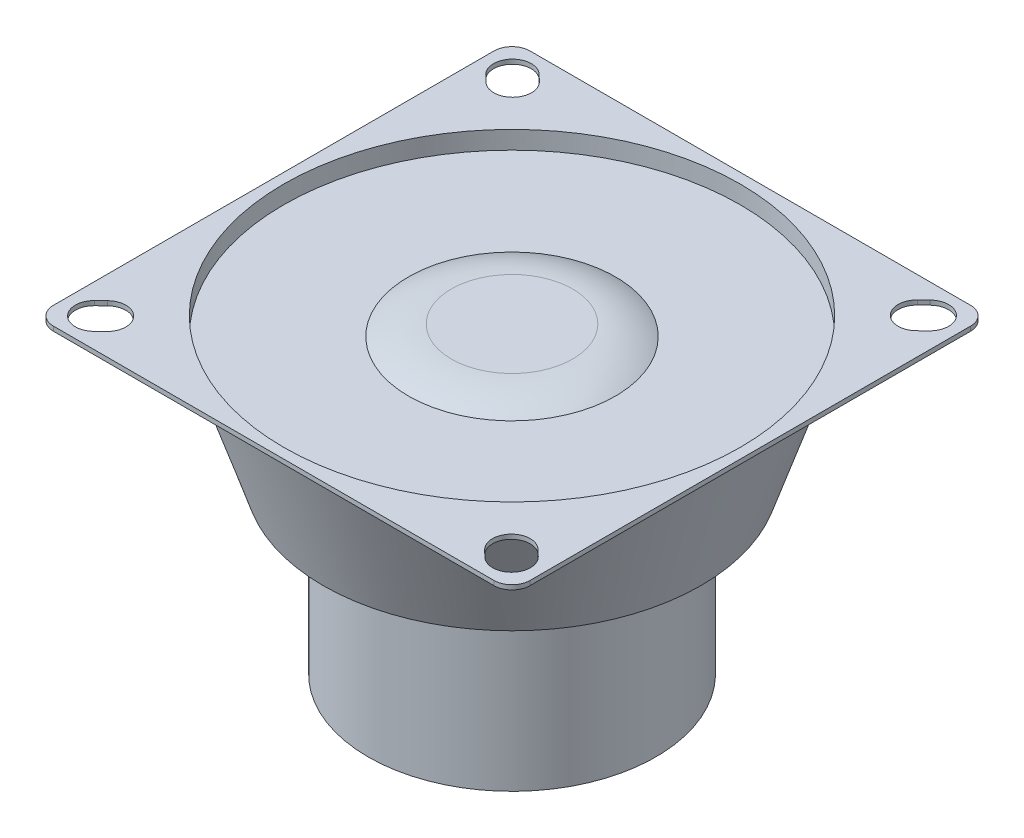
ISO-10303-21;
HEADER;
FILE_DESCRIPTION(('STEP AP214'),'2;1');
FILE_NAME('part.step','',(''),(''),'','','');
FILE_SCHEMA(('AUTOMOTIVE_DESIGN { 1 0 10303 214 1 1 1 1 }'));
ENDSEC;
DATA;
#1=APPLICATION_CONTEXT('core data for automotive mechanical design processes');
#2=APPLICATION_PROTOCOL_DEFINITION('international standard','automotive_design',2000,#1);
#3=PRODUCT_CONTEXT('',#1,'mechanical');
#4=PRODUCT('Part','Part','',(#3));
#5=PRODUCT_RELATED_PRODUCT_CATEGORY('part','',(#4));
#6=PRODUCT_DEFINITION_FORMATION('','',#4);
#7=PRODUCT_DEFINITION_CONTEXT('part definition',#1,'design');
#8=PRODUCT_DEFINITION('design','',#6,#7);
#9=PRODUCT_DEFINITION_SHAPE('','',#8);
#10=(LENGTH_UNIT() NAMED_UNIT(*) SI_UNIT(.MILLI.,.METRE.));
#11=(NAMED_UNIT(*) PLANE_ANGLE_UNIT() SI_UNIT($,.RADIAN.));
#12=(NAMED_UNIT(*) SI_UNIT($,.STERADIAN.) SOLID_ANGLE_UNIT());
#13=UNCERTAINTY_MEASURE_WITH_UNIT(LENGTH_MEASURE(1.E-05),#10,'distance_accuracy_value','');
#14=(GEOMETRIC_REPRESENTATION_CONTEXT(3) GLOBAL_UNCERTAINTY_ASSIGNED_CONTEXT((#13)) GLOBAL_UNIT_ASSIGNED_CONTEXT((#10,
#11,#12)) REPRESENTATION_CONTEXT('',''));
#15=CARTESIAN_POINT('',(0.,0.,0.));
#16=DIRECTION('',(0.,0.,1.));
#17=DIRECTION('',(1.,0.,0.));
#18=AXIS2_PLACEMENT_3D('',#15,#16,#17);
#19=CARTESIAN_POINT('',(0.,19.,0.));
#20=DIRECTION('',(0.,-1.,0.));
#21=DIRECTION('',(0.,0.,-1.));
#22=AXIS2_PLACEMENT_3D('',#19,#20,#21);
#23=CYLINDRICAL_SURFACE('',#22,16.);
#24=CARTESIAN_POINT('',(0.,19.,0.));
#25=DIRECTION('',(0.,1.,0.));
#26=DIRECTION('',(0.,0.,1.));
#27=AXIS2_PLACEMENT_3D('',#24,#25,#26);
#28=CIRCLE('',#27,16.);
#29=CARTESIAN_POINT('',(0.,19.,16.));
#30=VERTEX_POINT('',#29);
#31=EDGE_CURVE('E364',#30,#30,#28,.T.);
#32=ORIENTED_EDGE('',*,*,#31,.F.);
#33=EDGE_LOOP('',(#32));
#34=FACE_BOUND('',#33,.T.);
#35=CARTESIAN_POINT('',(0.,0.,0.));
#36=DIRECTION('',(0.,1.,0.));
#37=DIRECTION('',(0.,0.,1.));
#38=AXIS2_PLACEMENT_3D('',#35,#36,#37);
#39=CIRCLE('',#38,16.);
#40=CARTESIAN_POINT('',(0.,0.,16.));
#41=VERTEX_POINT('',#40);
#42=EDGE_CURVE('E368',#41,#41,#39,.T.);
#43=ORIENTED_EDGE('',*,*,#42,.T.);
#44=EDGE_LOOP('',(#43));
#45=FACE_BOUND('',#44,.T.);
#46=ADVANCED_FACE('F43',(#34,#45),#23,.T.);
#47=CARTESIAN_POINT('',(0.,0.,0.));
#48=DIRECTION('',(0.,1.,0.));
#49=DIRECTION('',(0.,0.,1.));
#50=AXIS2_PLACEMENT_3D('',#47,#48,#49);
#51=PLANE('',#50);
#52=ORIENTED_EDGE('',*,*,#42,.F.);
#53=EDGE_LOOP('',(#52));
#54=FACE_BOUND('',#53,.T.);
#55=ADVANCED_FACE('F446',(#54),#51,.F.);
#56=CARTESIAN_POINT('',(0.,19.,0.));
#57=DIRECTION('',(0.,1.,0.));
#58=DIRECTION('',(0.,0.,1.));
#59=AXIS2_PLACEMENT_3D('',#56,#57,#58);
#60=CONICAL_SURFACE('',#59,21.,0.322885911618952);
#61=CARTESIAN_POINT('',(0.,34.,0.));
#62=DIRECTION('',(0.,1.,0.));
#63=DIRECTION('',(0.,0.,1.));
#64=AXIS2_PLACEMENT_3D('',#61,#62,#63);
#65=CIRCLE('',#64,26.0189297925311);
#66=CARTESIAN_POINT('',(0.,34.,26.0189297925311));
#67=VERTEX_POINT('',#66);
#68=EDGE_CURVE('E363',#67,#67,#65,.T.);
#69=ORIENTED_EDGE('',*,*,#68,.F.);
#70=EDGE_LOOP('',(#69));
#71=FACE_BOUND('',#70,.T.);
#72=CARTESIAN_POINT('',(0.,19.,0.));
#73=DIRECTION('',(0.,1.,0.));
#74=DIRECTION('',(0.,0.,1.));
#75=AXIS2_PLACEMENT_3D('',#72,#73,#74);
#76=CIRCLE('',#75,21.);
#77=CARTESIAN_POINT('',(0.,19.,21.));
#78=VERTEX_POINT('',#77);
#79=EDGE_CURVE('E360',#78,#78,#76,.T.);
#80=ORIENTED_EDGE('',*,*,#79,.T.);
#81=EDGE_LOOP('',(#80));
#82=FACE_BOUND('',#81,.T.);
#83=ADVANCED_FACE('F452',(#71,#82),#60,.T.);
#84=CARTESIAN_POINT('',(0.,19.,0.));
#85=DIRECTION('',(0.,1.,0.));
#86=DIRECTION('',(0.,0.,1.));
#87=AXIS2_PLACEMENT_3D('',#84,#85,#86);
#88=PLANE('',#87);
#89=ORIENTED_EDGE('',*,*,#31,.T.);
#90=EDGE_LOOP('',(#89));
#91=FACE_BOUND('',#90,.T.);
#92=ORIENTED_EDGE('',*,*,#79,.F.);
#93=EDGE_LOOP('',(#92));
#94=FACE_BOUND('',#93,.T.);
#95=ADVANCED_FACE('F459',(#91,#94),#88,.F.);
#96=CARTESIAN_POINT('',(-24.5,34.5,24.5));
#97=DIRECTION('',(0.,-1.,0.));
#98=DIRECTION('',(0.,0.,-1.));
#99=AXIS2_PLACEMENT_3D('',#96,#97,#98);
#100=CYLINDRICAL_SURFACE('',#99,2.);
#101=CARTESIAN_POINT('',(-24.5,34.,24.5));
#102=DIRECTION('',(0.,1.,0.));
#103=DIRECTION('',(0.,0.,1.));
#104=AXIS2_PLACEMENT_3D('',#101,#102,#103);
#105=CIRCLE('',#104,2.);
#106=CARTESIAN_POINT('',(-26.5,34.,24.5));
#107=VERTEX_POINT('',#106);
#108=CARTESIAN_POINT('',(-24.5,34.,26.5));
#109=VERTEX_POINT('',#108);
#110=EDGE_CURVE('E300',#107,#109,#105,.T.);
#111=ORIENTED_EDGE('',*,*,#110,.T.);
#112=DIRECTION('',(0.,-1.,0.));
#113=VECTOR('',#112,1.);
#114=CARTESIAN_POINT('',(-24.5,34.5,26.5));
#115=LINE('',#114,#113);
#116=CARTESIAN_POINT('',(-24.5,34.5,26.5));
#117=VERTEX_POINT('',#116);
#118=EDGE_CURVE('E357',#117,#109,#115,.T.);
#119=ORIENTED_EDGE('',*,*,#118,.F.);
#120=CARTESIAN_POINT('',(-24.5,34.5,24.5));
#121=DIRECTION('',(0.,1.,0.));
#122=DIRECTION('',(0.,0.,1.));
#123=AXIS2_PLACEMENT_3D('',#120,#121,#122);
#124=CIRCLE('',#123,2.);
#125=CARTESIAN_POINT('',(-26.5,34.5,24.5));
#126=VERTEX_POINT('',#125);
#127=EDGE_CURVE('E303',#126,#117,#124,.T.);
#128=ORIENTED_EDGE('',*,*,#127,.F.);
#129=DIRECTION('',(0.,-1.,0.));
#130=VECTOR('',#129,1.);
#131=CARTESIAN_POINT('',(-26.5,34.5,24.5));
#132=LINE('',#131,#130);
#133=EDGE_CURVE('E321',#126,#107,#132,.T.);
#134=ORIENTED_EDGE('',*,*,#133,.T.);
#135=EDGE_LOOP('',(#111,#119,#128,#134));
#136=FACE_BOUND('',#135,.T.);
#137=ADVANCED_FACE('F465',(#136),#100,.T.);
#138=CARTESIAN_POINT('',(-24.5,34.5,26.5));
#139=DIRECTION('',(0.,0.,-1.));
#140=DIRECTION('',(-1.,0.,0.));
#141=AXIS2_PLACEMENT_3D('',#138,#139,#140);
#142=PLANE('',#141);
#143=DIRECTION('',(1.,0.,0.));
#144=VECTOR('',#143,1.);
#145=CARTESIAN_POINT('',(-24.5,34.,26.5));
#146=LINE('',#145,#144);
#147=CARTESIAN_POINT('',(24.5,34.,26.5));
#148=VERTEX_POINT('',#147);
#149=EDGE_CURVE('E324',#109,#148,#146,.T.);
#150=ORIENTED_EDGE('',*,*,#149,.T.);
#151=DIRECTION('',(0.,-1.,0.));
#152=VECTOR('',#151,1.);
#153=CARTESIAN_POINT('',(24.5,34.5,26.5));
#154=LINE('',#153,#152);
#155=CARTESIAN_POINT('',(24.5,34.5,26.5));
#156=VERTEX_POINT('',#155);
#157=EDGE_CURVE('E354',#156,#148,#154,.T.);
#158=ORIENTED_EDGE('',*,*,#157,.F.);
#159=DIRECTION('',(1.,0.,0.));
#160=VECTOR('',#159,1.);
#161=CARTESIAN_POINT('',(-24.5,34.5,26.5));
#162=LINE('',#161,#160);
#163=EDGE_CURVE('E306',#117,#156,#162,.T.);
#164=ORIENTED_EDGE('',*,*,#163,.F.);
#165=ORIENTED_EDGE('',*,*,#118,.T.);
#166=EDGE_LOOP('',(#150,#158,#164,#165));
#167=FACE_BOUND('',#166,.T.);
#168=ADVANCED_FACE('F512',(#167),#142,.F.);
#169=CARTESIAN_POINT('',(24.5,34.5,24.5));
#170=DIRECTION('',(0.,-1.,0.));
#171=DIRECTION('',(0.,0.,-1.));
#172=AXIS2_PLACEMENT_3D('',#169,#170,#171);
#173=CYLINDRICAL_SURFACE('',#172,2.);
#174=CARTESIAN_POINT('',(24.5,34.,24.5));
#175=DIRECTION('',(0.,1.,0.));
#176=DIRECTION('',(0.,0.,1.));
#177=AXIS2_PLACEMENT_3D('',#174,#175,#176);
#178=CIRCLE('',#177,2.);
#179=CARTESIAN_POINT('',(26.5,34.,24.5));
#180=VERTEX_POINT('',#179);
#181=EDGE_CURVE('E326',#148,#180,#178,.T.);
#182=ORIENTED_EDGE('',*,*,#181,.T.);
#183=DIRECTION('',(0.,-1.,0.));
#184=VECTOR('',#183,1.);
#185=CARTESIAN_POINT('',(26.5,34.5,24.5));
#186=LINE('',#185,#184);
#187=CARTESIAN_POINT('',(26.5,34.5,24.5));
#188=VERTEX_POINT('',#187);
#189=EDGE_CURVE('E351',#188,#180,#186,.T.);
#190=ORIENTED_EDGE('',*,*,#189,.F.);
#191=CARTESIAN_POINT('',(24.5,34.5,24.5));
#192=DIRECTION('',(0.,1.,0.));
#193=DIRECTION('',(0.,0.,1.));
#194=AXIS2_PLACEMENT_3D('',#191,#192,#193);
#195=CIRCLE('',#194,2.);
#196=EDGE_CURVE('E309',#156,#188,#195,.T.);
#197=ORIENTED_EDGE('',*,*,#196,.F.);
#198=ORIENTED_EDGE('',*,*,#157,.T.);
#199=EDGE_LOOP('',(#182,#190,#197,#198));
#200=FACE_BOUND('',#199,.T.);
#201=ADVANCED_FACE('F508',(#200),#173,.T.);
#202=CARTESIAN_POINT('',(26.5,34.5,-24.5));
#203=DIRECTION('',(-1.,0.,0.));
#204=DIRECTION('',(0.,0.,1.));
#205=AXIS2_PLACEMENT_3D('',#202,#203,#204);
#206=PLANE('',#205);
#207=DIRECTION('',(0.,0.,-1.));
#208=VECTOR('',#207,1.);
#209=CARTESIAN_POINT('',(26.5,34.,-24.5));
#210=LINE('',#209,#208);
#211=CARTESIAN_POINT('',(26.5,34.,-24.5));
#212=VERTEX_POINT('',#211);
#213=EDGE_CURVE('E328',#180,#212,#210,.T.);
#214=ORIENTED_EDGE('',*,*,#213,.T.);
#215=DIRECTION('',(0.,-1.,0.));
#216=VECTOR('',#215,1.);
#217=CARTESIAN_POINT('',(26.5,34.5,-24.5));
#218=LINE('',#217,#216);
#219=CARTESIAN_POINT('',(26.5,34.5,-24.5));
#220=VERTEX_POINT('',#219);
#221=EDGE_CURVE('E348',#220,#212,#218,.T.);
#222=ORIENTED_EDGE('',*,*,#221,.F.);
#223=DIRECTION('',(0.,0.,-1.));
#224=VECTOR('',#223,1.);
#225=CARTESIAN_POINT('',(26.5,34.5,-24.5));
#226=LINE('',#225,#224);
#227=EDGE_CURVE('E311',#188,#220,#226,.T.);
#228=ORIENTED_EDGE('',*,*,#227,.F.);
#229=ORIENTED_EDGE('',*,*,#189,.T.);
#230=EDGE_LOOP('',(#214,#222,#228,#229));
#231=FACE_BOUND('',#230,.T.);
#232=ADVANCED_FACE('F505',(#231),#206,.F.);
#233=CARTESIAN_POINT('',(24.5,34.5,-24.5));
#234=DIRECTION('',(0.,-1.,0.));
#235=DIRECTION('',(0.,0.,-1.));
#236=AXIS2_PLACEMENT_3D('',#233,#234,#235);
#237=CYLINDRICAL_SURFACE('',#236,2.);
#238=CARTESIAN_POINT('',(24.5,34.,-24.5));
#239=DIRECTION('',(0.,1.,0.));
#240=DIRECTION('',(0.,0.,-1.));
#241=AXIS2_PLACEMENT_3D('',#238,#239,#240);
#242=CIRCLE('',#241,2.);
#243=CARTESIAN_POINT('',(24.5,34.,-26.5));
#244=VERTEX_POINT('',#243);
#245=EDGE_CURVE('E330',#212,#244,#242,.T.);
#246=ORIENTED_EDGE('',*,*,#245,.T.);
#247=DIRECTION('',(0.,-1.,0.));
#248=VECTOR('',#247,1.);
#249=CARTESIAN_POINT('',(24.5,34.5,-26.5));
#250=LINE('',#249,#248);
#251=CARTESIAN_POINT('',(24.5,34.5,-26.5));
#252=VERTEX_POINT('',#251);
#253=EDGE_CURVE('E345',#252,#244,#250,.T.);
#254=ORIENTED_EDGE('',*,*,#253,.F.);
#255=CARTESIAN_POINT('',(24.5,34.5,-24.5));
#256=DIRECTION('',(0.,1.,0.));
#257=DIRECTION('',(0.,0.,-1.));
#258=AXIS2_PLACEMENT_3D('',#255,#256,#257);
#259=CIRCLE('',#258,2.);
#260=EDGE_CURVE('E313',#220,#252,#259,.T.);
#261=ORIENTED_EDGE('',*,*,#260,.F.);
#262=ORIENTED_EDGE('',*,*,#221,.T.);
#263=EDGE_LOOP('',(#246,#254,#261,#262));
#264=FACE_BOUND('',#263,.T.);
#265=ADVANCED_FACE('F501',(#264),#237,.T.);
#266=CARTESIAN_POINT('',(-24.5,34.5,-26.5));
#267=DIRECTION('',(0.,0.,1.));
#268=DIRECTION('',(1.,0.,0.));
#269=AXIS2_PLACEMENT_3D('',#266,#267,#268);
#270=PLANE('',#269);
#271=DIRECTION('',(-1.,0.,0.));
#272=VECTOR('',#271,1.);
#273=CARTESIAN_POINT('',(-24.5,34.,-26.5));
#274=LINE('',#273,#272);
#275=CARTESIAN_POINT('',(-24.5,34.,-26.5));
#276=VERTEX_POINT('',#275);
#277=EDGE_CURVE('E332',#244,#276,#274,.T.);
#278=ORIENTED_EDGE('',*,*,#277,.T.);
#279=DIRECTION('',(0.,-1.,0.));
#280=VECTOR('',#279,1.);
#281=CARTESIAN_POINT('',(-24.5,34.5,-26.5));
#282=LINE('',#281,#280);
#283=CARTESIAN_POINT('',(-24.5,34.5,-26.5));
#284=VERTEX_POINT('',#283);
#285=EDGE_CURVE('E342',#284,#276,#282,.T.);
#286=ORIENTED_EDGE('',*,*,#285,.F.);
#287=DIRECTION('',(-1.,0.,0.));
#288=VECTOR('',#287,1.);
#289=CARTESIAN_POINT('',(-24.5,34.5,-26.5));
#290=LINE('',#289,#288);
#291=EDGE_CURVE('E315',#252,#284,#290,.T.);
#292=ORIENTED_EDGE('',*,*,#291,.F.);
#293=ORIENTED_EDGE('',*,*,#253,.T.);
#294=EDGE_LOOP('',(#278,#286,#292,#293));
#295=FACE_BOUND('',#294,.T.);
#296=ADVANCED_FACE('F496',(#295),#270,.F.);
#297=CARTESIAN_POINT('',(-24.5,34.5,-24.5));
#298=DIRECTION('',(0.,-1.,0.));
#299=DIRECTION('',(0.,0.,-1.));
#300=AXIS2_PLACEMENT_3D('',#297,#298,#299);
#301=CYLINDRICAL_SURFACE('',#300,2.);
#302=CARTESIAN_POINT('',(-24.5,34.,-24.5));
#303=DIRECTION('',(0.,1.,0.));
#304=DIRECTION('',(0.,0.,1.));
#305=AXIS2_PLACEMENT_3D('',#302,#303,#304);
#306=CIRCLE('',#305,2.);
#307=CARTESIAN_POINT('',(-26.5,34.,-24.5));
#308=VERTEX_POINT('',#307);
#309=EDGE_CURVE('E334',#276,#308,#306,.T.);
#310=ORIENTED_EDGE('',*,*,#309,.T.);
#311=DIRECTION('',(0.,-1.,0.));
#312=VECTOR('',#311,1.);
#313=CARTESIAN_POINT('',(-26.5,34.5,-24.5));
#314=LINE('',#313,#312);
#315=CARTESIAN_POINT('',(-26.5,34.5,-24.5));
#316=VERTEX_POINT('',#315);
#317=EDGE_CURVE('E339',#316,#308,#314,.T.);
#318=ORIENTED_EDGE('',*,*,#317,.F.);
#319=CARTESIAN_POINT('',(-24.5,34.5,-24.5));
#320=DIRECTION('',(0.,1.,0.));
#321=DIRECTION('',(0.,0.,1.));
#322=AXIS2_PLACEMENT_3D('',#319,#320,#321);
#323=CIRCLE('',#322,2.);
#324=EDGE_CURVE('E317',#284,#316,#323,.T.);
#325=ORIENTED_EDGE('',*,*,#324,.F.);
#326=ORIENTED_EDGE('',*,*,#285,.T.);
#327=EDGE_LOOP('',(#310,#318,#325,#326));
#328=FACE_BOUND('',#327,.T.);
#329=ADVANCED_FACE('F490',(#328),#301,.T.);
#330=CARTESIAN_POINT('',(-26.5,34.5,-24.5));
#331=DIRECTION('',(1.,0.,0.));
#332=DIRECTION('',(0.,0.,-1.));
#333=AXIS2_PLACEMENT_3D('',#330,#331,#332);
#334=PLANE('',#333);
#335=DIRECTION('',(0.,0.,1.));
#336=VECTOR('',#335,1.);
#337=CARTESIAN_POINT('',(-26.5,34.,-24.5));
#338=LINE('',#337,#336);
#339=EDGE_CURVE('E307',#308,#107,#338,.T.);
#340=ORIENTED_EDGE('',*,*,#339,.T.);
#341=ORIENTED_EDGE('',*,*,#133,.F.);
#342=DIRECTION('',(0.,0.,1.));
#343=VECTOR('',#342,1.);
#344=CARTESIAN_POINT('',(-26.5,34.5,-24.5));
#345=LINE('',#344,#343);
#346=EDGE_CURVE('E319',#316,#126,#345,.T.);
#347=ORIENTED_EDGE('',*,*,#346,.F.);
#348=ORIENTED_EDGE('',*,*,#317,.T.);
#349=EDGE_LOOP('',(#340,#341,#347,#348));
#350=FACE_BOUND('',#349,.T.);
#351=ADVANCED_FACE('F486',(#350),#334,.F.);
#352=CARTESIAN_POINT('',(-24.5,34.5,24.5));
#353=DIRECTION('',(0.,1.,0.));
#354=DIRECTION('',(0.,0.,1.));
#355=AXIS2_PLACEMENT_3D('',#352,#353,#354);
#356=PLANE('',#355);
#357=CARTESIAN_POINT('',(-22.4843336217345,34.5,-22.5564617829675));
#358=DIRECTION('',(0.,1.,0.));
#359=DIRECTION('',(0.,0.,-1.));
#360=AXIS2_PLACEMENT_3D('',#357,#358,#359);
#361=CIRCLE('',#360,2.10000000000005);
#362=CARTESIAN_POINT('',(-23.9446263726752,34.5,-21.0473080195787));
#363=VERTEX_POINT('',#362);
#364=CARTESIAN_POINT('',(-21.0240408707939,34.5,-24.0656155463562));
#365=VERTEX_POINT('',#364);
#366=EDGE_CURVE('E58',#363,#365,#361,.T.);
#367=ORIENTED_EDGE('',*,*,#366,.F.);
#368=DIRECTION('',(0.718644649232708,0.,0.695377500447921));
#369=VECTOR('',#368,1.);
#370=CARTESIAN_POINT('',(-23.9446263726752,34.5,-21.0473080195787));
#371=LINE('',#370,#369);
#372=CARTESIAN_POINT('',(-24.6632710219078,34.5,-21.7426855200265));
#373=VERTEX_POINT('',#372);
#374=EDGE_CURVE('E242',#373,#363,#371,.T.);
#375=ORIENTED_EDGE('',*,*,#374,.F.);
#376=CARTESIAN_POINT('',(-23.2029782709671,34.5,-23.2518392834152));
#377=DIRECTION('',(0.,1.,0.));
#378=DIRECTION('',(0.,0.,-1.));
#379=AXIS2_PLACEMENT_3D('',#376,#377,#378);
#380=CIRCLE('',#379,2.10000000000003);
#381=CARTESIAN_POINT('',(-21.7426855200266,34.5,-24.7609930468041));
#382=VERTEX_POINT('',#381);
#383=EDGE_CURVE('E251',#382,#373,#380,.T.);
#384=ORIENTED_EDGE('',*,*,#383,.F.);
#385=DIRECTION('',(-0.718644649232741,0.,-0.695377500447887));
#386=VECTOR('',#385,1.);
#387=CARTESIAN_POINT('',(-21.0240408707939,34.5,-24.0656155463562));
#388=LINE('',#387,#386);
#389=EDGE_CURVE('E254',#365,#382,#388,.T.);
#390=ORIENTED_EDGE('',*,*,#389,.F.);
#391=EDGE_LOOP('',(#367,#375,#384,#390));
#392=FACE_BOUND('',#391,.T.);
#393=CARTESIAN_POINT('',(22.4843336217345,34.5,22.5564617829675));
#394=DIRECTION('',(0.,1.,0.));
#395=DIRECTION('',(0.,0.,-1.));
#396=AXIS2_PLACEMENT_3D('',#393,#394,#395);
#397=CIRCLE('',#396,2.1);
#398=CARTESIAN_POINT('',(23.9446263726752,34.5,21.0473080195787));
#399=VERTEX_POINT('',#398);
#400=CARTESIAN_POINT('',(21.024040870794,34.5,24.0656155463561));
#401=VERTEX_POINT('',#400);
#402=EDGE_CURVE('E66',#399,#401,#397,.T.);
#403=ORIENTED_EDGE('',*,*,#402,.F.);
#404=DIRECTION('',(-0.718644649232706,0.,-0.695377500447923));
#405=VECTOR('',#404,1.);
#406=CARTESIAN_POINT('',(23.9446263726752,34.5,21.0473080195787));
#407=LINE('',#406,#405);
#408=CARTESIAN_POINT('',(24.6632710219078,34.5,21.7426855200265));
#409=VERTEX_POINT('',#408);
#410=EDGE_CURVE('E261',#409,#399,#407,.T.);
#411=ORIENTED_EDGE('',*,*,#410,.F.);
#412=CARTESIAN_POINT('',(23.2029782709673,34.5,23.2518392834153));
#413=DIRECTION('',(0.,1.,0.));
#414=DIRECTION('',(0.,0.,-1.));
#415=AXIS2_PLACEMENT_3D('',#412,#413,#414);
#416=CIRCLE('',#415,2.09999999999999);
#417=CARTESIAN_POINT('',(21.7426855200267,34.5,24.760993046804));
#418=VERTEX_POINT('',#417);
#419=EDGE_CURVE('E267',#418,#409,#416,.T.);
#420=ORIENTED_EDGE('',*,*,#419,.F.);
#421=DIRECTION('',(0.718644649232711,0.,0.695377500447918));
#422=VECTOR('',#421,1.);
#423=CARTESIAN_POINT('',(21.024040870794,34.5,24.0656155463561));
#424=LINE('',#423,#422);
#425=EDGE_CURVE('E270',#401,#418,#424,.T.);
#426=ORIENTED_EDGE('',*,*,#425,.F.);
#427=EDGE_LOOP('',(#403,#411,#420,#426));
#428=FACE_BOUND('',#427,.T.);
#429=CARTESIAN_POINT('',(-22.4843336217344,34.5,22.5564617829676));
#430=DIRECTION('',(0.,1.,0.));
#431=DIRECTION('',(0.,0.,1.));
#432=AXIS2_PLACEMENT_3D('',#429,#430,#431);
#433=CIRCLE('',#432,2.10000000000005);
#434=CARTESIAN_POINT('',(-21.0240408707938,34.5,24.0656155463564));
#435=VERTEX_POINT('',#434);
#436=CARTESIAN_POINT('',(-23.9446263726751,34.5,21.0473080195788));
#437=VERTEX_POINT('',#436);
#438=EDGE_CURVE('E210',#435,#437,#433,.T.);
#439=ORIENTED_EDGE('',*,*,#438,.F.);
#440=DIRECTION('',(0.718644649232741,0.,-0.695377500447887));
#441=VECTOR('',#440,1.);
#442=CARTESIAN_POINT('',(-21.0240408707938,34.5,24.0656155463564));
#443=LINE('',#442,#441);
#444=CARTESIAN_POINT('',(-21.7426855200265,34.5,24.7609930468042));
#445=VERTEX_POINT('',#444);
#446=EDGE_CURVE('E219',#445,#435,#443,.T.);
#447=ORIENTED_EDGE('',*,*,#446,.F.);
#448=CARTESIAN_POINT('',(-23.2029782709671,34.5,23.2518392834154));
#449=DIRECTION('',(0.,1.,0.));
#450=DIRECTION('',(0.,0.,1.));
#451=AXIS2_PLACEMENT_3D('',#448,#449,#450);
#452=CIRCLE('',#451,2.10000000000003);
#453=CARTESIAN_POINT('',(-24.6632710219077,34.5,21.7426855200266));
#454=VERTEX_POINT('',#453);
#455=EDGE_CURVE('E225',#454,#445,#452,.T.);
#456=ORIENTED_EDGE('',*,*,#455,.F.);
#457=DIRECTION('',(-0.718644649232701,0.,0.695377500447928));
#458=VECTOR('',#457,1.);
#459=CARTESIAN_POINT('',(-23.9446263726751,34.5,21.0473080195788));
#460=LINE('',#459,#458);
#461=EDGE_CURVE('E232',#437,#454,#460,.T.);
#462=ORIENTED_EDGE('',*,*,#461,.F.);
#463=EDGE_LOOP('',(#439,#447,#456,#462));
#464=FACE_BOUND('',#463,.T.);
#465=CARTESIAN_POINT('',(22.4843336217345,34.5,-22.5564617829675));
#466=DIRECTION('',(0.,1.,0.));
#467=DIRECTION('',(0.,0.,1.));
#468=AXIS2_PLACEMENT_3D('',#465,#466,#467);
#469=CIRCLE('',#468,2.10000000000006);
#470=CARTESIAN_POINT('',(21.0240408707939,34.5,-24.0656155463563));
#471=VERTEX_POINT('',#470);
#472=CARTESIAN_POINT('',(23.9446263726752,34.5,-21.0473080195788));
#473=VERTEX_POINT('',#472);
#474=EDGE_CURVE('E258',#471,#473,#469,.T.);
#475=ORIENTED_EDGE('',*,*,#474,.F.);
#476=DIRECTION('',(-0.71864464923286,0.,0.695377500447764));
#477=VECTOR('',#476,1.);
#478=CARTESIAN_POINT('',(21.0240408707939,34.5,-24.0656155463563));
#479=LINE('',#478,#477);
#480=CARTESIAN_POINT('',(21.7426855200266,34.5,-24.7609930468039));
#481=VERTEX_POINT('',#480);
#482=EDGE_CURVE('E281',#481,#471,#479,.T.);
#483=ORIENTED_EDGE('',*,*,#482,.F.);
#484=CARTESIAN_POINT('',(23.2029782709672,34.5,-23.2518392834154));
#485=DIRECTION('',(0.,1.,0.));
#486=DIRECTION('',(0.,0.,1.));
#487=AXIS2_PLACEMENT_3D('',#484,#485,#486);
#488=CIRCLE('',#487,2.09999999999995);
#489=CARTESIAN_POINT('',(24.6632710219077,34.5,-21.7426855200266));
#490=VERTEX_POINT('',#489);
#491=EDGE_CURVE('E278',#490,#481,#488,.T.);
#492=ORIENTED_EDGE('',*,*,#491,.F.);
#493=DIRECTION('',(0.718644649232706,0.,-0.695377500447923));
#494=VECTOR('',#493,1.);
#495=CARTESIAN_POINT('',(23.9446263726752,34.5,-21.0473080195787));
#496=LINE('',#495,#494);
#497=EDGE_CURVE('E275',#473,#490,#496,.T.);
#498=ORIENTED_EDGE('',*,*,#497,.F.);
#499=EDGE_LOOP('',(#475,#483,#492,#498));
#500=FACE_BOUND('',#499,.T.);
#501=CARTESIAN_POINT('',(0.,34.5,0.));
#502=DIRECTION('',(0.,1.,0.));
#503=DIRECTION('',(0.,0.,1.));
#504=AXIS2_PLACEMENT_3D('',#501,#502,#503);
#505=CIRCLE('',#504,25.375);
#506=CARTESIAN_POINT('',(0.,34.5,25.375));
#507=VERTEX_POINT('',#506);
#508=EDGE_CURVE('E296',#507,#507,#505,.T.);
#509=ORIENTED_EDGE('',*,*,#508,.F.);
#510=EDGE_LOOP('',(#509));
#511=FACE_BOUND('',#510,.T.);
#512=ORIENTED_EDGE('',*,*,#127,.T.);
#513=ORIENTED_EDGE('',*,*,#163,.T.);
#514=ORIENTED_EDGE('',*,*,#196,.T.);
#515=ORIENTED_EDGE('',*,*,#227,.T.);
#516=ORIENTED_EDGE('',*,*,#260,.T.);
#517=ORIENTED_EDGE('',*,*,#291,.T.);
#518=ORIENTED_EDGE('',*,*,#324,.T.);
#519=ORIENTED_EDGE('',*,*,#346,.T.);
#520=EDGE_LOOP('',(#512,#513,#514,#515,#516,#517,#518,#519));
#521=FACE_BOUND('',#520,.T.);
#522=ADVANCED_FACE('F229',(#392,#428,#464,#500,#511,#521),#356,.T.);
#523=CARTESIAN_POINT('',(-24.5,34.,24.5));
#524=DIRECTION('',(0.,1.,0.));
#525=DIRECTION('',(0.,0.,1.));
#526=AXIS2_PLACEMENT_3D('',#523,#524,#525);
#527=PLANE('',#526);
#528=DIRECTION('',(0.718644649232708,0.,0.695377500447921));
#529=VECTOR('',#528,1.);
#530=CARTESIAN_POINT('',(-1.4701238961311,34.,0.699550281858592));
#531=LINE('',#530,#529);
#532=CARTESIAN_POINT('',(-24.6632710219078,34.,-21.7426855200265));
#533=VERTEX_POINT('',#532);
#534=CARTESIAN_POINT('',(-23.9446263726752,34.,-21.0473080195787));
#535=VERTEX_POINT('',#534);
#536=EDGE_CURVE('E51',#533,#535,#531,.T.);
#537=ORIENTED_EDGE('',*,*,#536,.T.);
#538=CARTESIAN_POINT('',(-22.4843336217345,34.,-22.5564617829675));
#539=DIRECTION('',(0.,1.,0.));
#540=DIRECTION('',(0.,0.,1.));
#541=AXIS2_PLACEMENT_3D('',#538,#539,#540);
#542=CIRCLE('',#541,2.10000000000005);
#543=CARTESIAN_POINT('',(-21.0240408707939,34.,-24.0656155463562));
#544=VERTEX_POINT('',#543);
#545=EDGE_CURVE('E11',#535,#544,#542,.T.);
#546=ORIENTED_EDGE('',*,*,#545,.T.);
#547=DIRECTION('',(-0.718644649232741,0.,-0.695377500447887));
#548=VECTOR('',#547,1.);
#549=CARTESIAN_POINT('',(1.45046160575,34.,-2.31875724492112));
#550=LINE('',#549,#548);
#551=CARTESIAN_POINT('',(-21.7426855200266,34.,-24.7609930468041));
#552=VERTEX_POINT('',#551);
#553=EDGE_CURVE('E408',#544,#552,#550,.T.);
#554=ORIENTED_EDGE('',*,*,#553,.T.);
#555=CARTESIAN_POINT('',(-23.2029782709671,34.,-23.2518392834152));
#556=DIRECTION('',(0.,1.,0.));
#557=DIRECTION('',(0.,0.,1.));
#558=AXIS2_PLACEMENT_3D('',#555,#556,#557);
#559=CIRCLE('',#558,2.10000000000003);
#560=EDGE_CURVE('E411',#552,#533,#559,.T.);
#561=ORIENTED_EDGE('',*,*,#560,.T.);
#562=EDGE_LOOP('',(#537,#546,#554,#561));
#563=FACE_BOUND('',#562,.T.);
#564=DIRECTION('',(-0.718644649232706,0.,-0.695377500447923));
#565=VECTOR('',#564,1.);
#566=CARTESIAN_POINT('',(0.650804109253899,34.,-1.49234341831986));
#567=LINE('',#566,#565);
#568=CARTESIAN_POINT('',(24.6632710219078,34.,21.7426855200265));
#569=VERTEX_POINT('',#568);
#570=CARTESIAN_POINT('',(23.9446263726752,34.,21.0473080195787));
#571=VERTEX_POINT('',#570);
#572=EDGE_CURVE('E402',#569,#571,#567,.T.);
#573=ORIENTED_EDGE('',*,*,#572,.T.);
#574=CARTESIAN_POINT('',(22.4843336217345,34.,22.5564617829675));
#575=DIRECTION('',(0.,1.,0.));
#576=DIRECTION('',(0.,0.,1.));
#577=AXIS2_PLACEMENT_3D('',#574,#575,#576);
#578=CIRCLE('',#577,2.1);
#579=CARTESIAN_POINT('',(21.024040870794,34.,24.0656155463561));
#580=VERTEX_POINT('',#579);
#581=EDGE_CURVE('E405',#571,#580,#578,.T.);
#582=ORIENTED_EDGE('',*,*,#581,.T.);
#583=DIRECTION('',(0.718644649232711,0.,0.695377500447918));
#584=VECTOR('',#583,1.);
#585=CARTESIAN_POINT('',(-2.26978139262769,34.,1.5259641084575));
#586=LINE('',#585,#584);
#587=CARTESIAN_POINT('',(21.7426855200267,34.,24.760993046804));
#588=VERTEX_POINT('',#587);
#589=EDGE_CURVE('E396',#580,#588,#586,.T.);
#590=ORIENTED_EDGE('',*,*,#589,.T.);
#591=CARTESIAN_POINT('',(23.2029782709673,34.,23.2518392834153));
#592=DIRECTION('',(0.,1.,0.));
#593=DIRECTION('',(0.,0.,1.));
#594=AXIS2_PLACEMENT_3D('',#591,#592,#593);
#595=CIRCLE('',#594,2.09999999999999);
#596=EDGE_CURVE('E399',#588,#569,#595,.T.);
#597=ORIENTED_EDGE('',*,*,#596,.T.);
#598=EDGE_LOOP('',(#573,#582,#590,#597));
#599=FACE_BOUND('',#598,.T.);
#600=DIRECTION('',(0.718644649232741,0.,-0.695377500447887));
#601=VECTOR('',#600,1.);
#602=CARTESIAN_POINT('',(-23.0362750690418,34.,26.0127007832496));
#603=LINE('',#602,#601);
#604=CARTESIAN_POINT('',(-21.7426855200265,34.,24.7609930468042));
#605=VERTEX_POINT('',#604);
#606=CARTESIAN_POINT('',(-21.0240408707938,34.,24.0656155463564));
#607=VERTEX_POINT('',#606);
#608=EDGE_CURVE('E393',#605,#607,#603,.T.);
#609=ORIENTED_EDGE('',*,*,#608,.T.);
#610=CARTESIAN_POINT('',(-22.4843336217344,34.,22.5564617829676));
#611=DIRECTION('',(0.,1.,0.));
#612=DIRECTION('',(0.,0.,1.));
#613=AXIS2_PLACEMENT_3D('',#610,#611,#612);
#614=CIRCLE('',#613,2.10000000000005);
#615=CARTESIAN_POINT('',(-23.9446263726751,34.,21.0473080195788));
#616=VERTEX_POINT('',#615);
#617=EDGE_CURVE('E213',#607,#616,#614,.T.);
#618=ORIENTED_EDGE('',*,*,#617,.T.);
#619=DIRECTION('',(-0.718644649232701,0.,0.695377500447928));
#620=VECTOR('',#619,1.);
#621=CARTESIAN_POINT('',(-25.9568605709229,34.,22.9943932564722));
#622=LINE('',#621,#620);
#623=CARTESIAN_POINT('',(-24.6632710219077,34.,21.7426855200267));
#624=VERTEX_POINT('',#623);
#625=EDGE_CURVE('E387',#616,#624,#622,.T.);
#626=ORIENTED_EDGE('',*,*,#625,.T.);
#627=CARTESIAN_POINT('',(-23.2029782709671,34.,23.2518392834154));
#628=DIRECTION('',(0.,1.,0.));
#629=DIRECTION('',(0.,0.,1.));
#630=AXIS2_PLACEMENT_3D('',#627,#628,#629);
#631=CIRCLE('',#630,2.10000000000003);
#632=EDGE_CURVE('E390',#624,#605,#631,.T.);
#633=ORIENTED_EDGE('',*,*,#632,.T.);
#634=EDGE_LOOP('',(#609,#618,#626,#633));
#635=FACE_BOUND('',#634,.T.);
#636=DIRECTION('',(-0.71864464923286,0.,0.695377500447764));
#637=VECTOR('',#636,1.);
#638=CARTESIAN_POINT('',(-26.7565180674291,34.,22.1679794298621));
#639=LINE('',#638,#637);
#640=CARTESIAN_POINT('',(21.7426855200266,34.,-24.7609930468039));
#641=VERTEX_POINT('',#640);
#642=CARTESIAN_POINT('',(21.0240408707939,34.,-24.0656155463563));
#643=VERTEX_POINT('',#642);
#644=EDGE_CURVE('E381',#641,#643,#639,.T.);
#645=ORIENTED_EDGE('',*,*,#644,.T.);
#646=CARTESIAN_POINT('',(22.4843336217345,34.,-22.5564617829675));
#647=DIRECTION('',(0.,1.,0.));
#648=DIRECTION('',(0.,0.,1.));
#649=AXIS2_PLACEMENT_3D('',#646,#647,#648);
#650=CIRCLE('',#649,2.10000000000006);
#651=CARTESIAN_POINT('',(23.9446263726752,34.,-21.0473080195787));
#652=VERTEX_POINT('',#651);
#653=EDGE_CURVE('E384',#643,#652,#650,.T.);
#654=ORIENTED_EDGE('',*,*,#653,.T.);
#655=DIRECTION('',(0.718644649232706,0.,-0.695377500447923));
#656=VECTOR('',#655,1.);
#657=CARTESIAN_POINT('',(-23.8359325655381,34.,25.1862869566506));
#658=LINE('',#657,#656);
#659=CARTESIAN_POINT('',(24.6632710219077,34.,-21.7426855200265));
#660=VERTEX_POINT('',#659);
#661=EDGE_CURVE('E375',#652,#660,#658,.T.);
#662=ORIENTED_EDGE('',*,*,#661,.T.);
#663=CARTESIAN_POINT('',(23.2029782709672,34.,-23.2518392834154));
#664=DIRECTION('',(0.,1.,0.));
#665=DIRECTION('',(0.,0.,1.));
#666=AXIS2_PLACEMENT_3D('',#663,#664,#665);
#667=CIRCLE('',#666,2.09999999999995);
#668=EDGE_CURVE('E378',#660,#641,#667,.T.);
#669=ORIENTED_EDGE('',*,*,#668,.T.);
#670=EDGE_LOOP('',(#645,#654,#662,#669));
#671=FACE_BOUND('',#670,.T.);
#672=ORIENTED_EDGE('',*,*,#68,.T.);
#673=EDGE_LOOP('',(#672));
#674=FACE_BOUND('',#673,.T.);
#675=ORIENTED_EDGE('',*,*,#110,.F.);
#676=ORIENTED_EDGE('',*,*,#339,.F.);
#677=ORIENTED_EDGE('',*,*,#309,.F.);
#678=ORIENTED_EDGE('',*,*,#277,.F.);
#679=ORIENTED_EDGE('',*,*,#245,.F.);
#680=ORIENTED_EDGE('',*,*,#213,.F.);
#681=ORIENTED_EDGE('',*,*,#181,.F.);
#682=ORIENTED_EDGE('',*,*,#149,.F.);
#683=EDGE_LOOP('',(#675,#676,#677,#678,#679,#680,#681,#682));
#684=FACE_BOUND('',#683,.T.);
#685=ADVANCED_FACE('F415',(#563,#599,#635,#671,#674,#684),#527,.F.);
#686=CARTESIAN_POINT('',(0.,32.5,0.));
#687=DIRECTION('',(0.,1.,0.));
#688=DIRECTION('',(0.,0.,1.));
#689=AXIS2_PLACEMENT_3D('',#686,#687,#688);
#690=CYLINDRICAL_SURFACE('',#689,25.375);
#691=CARTESIAN_POINT('',(0.,32.5,0.));
#692=DIRECTION('',(0.,1.,0.));
#693=DIRECTION('',(0.,0.,1.));
#694=AXIS2_PLACEMENT_3D('',#691,#692,#693);
#695=CIRCLE('',#694,25.375);
#696=CARTESIAN_POINT('',(0.,32.5,25.375));
#697=VERTEX_POINT('',#696);
#698=EDGE_CURVE('E297',#697,#697,#695,.T.);
#699=ORIENTED_EDGE('',*,*,#698,.F.);
#700=EDGE_LOOP('',(#699));
#701=FACE_BOUND('',#700,.T.);
#702=ORIENTED_EDGE('',*,*,#508,.T.);
#703=EDGE_LOOP('',(#702));
#704=FACE_BOUND('',#703,.T.);
#705=ADVANCED_FACE('F474',(#701,#704),#690,.F.);
#706=CARTESIAN_POINT('',(0.,32.5,0.));
#707=DIRECTION('',(0.,1.,0.));
#708=DIRECTION('',(0.,0.,1.));
#709=AXIS2_PLACEMENT_3D('',#706,#707,#708);
#710=PLANE('',#709);
#711=CARTESIAN_POINT('',(0.,32.5,0.));
#712=DIRECTION('',(0.,1.,0.));
#713=DIRECTION('',(0.,0.,1.));
#714=AXIS2_PLACEMENT_3D('',#711,#712,#713);
#715=CIRCLE('',#714,11.5);
#716=CARTESIAN_POINT('',(0.,32.5,11.5));
#717=VERTEX_POINT('',#716);
#718=EDGE_CURVE('E287',#717,#717,#715,.T.);
#719=ORIENTED_EDGE('',*,*,#718,.F.);
#720=EDGE_LOOP('',(#719));
#721=FACE_BOUND('',#720,.T.);
#722=ORIENTED_EDGE('',*,*,#698,.T.);
#723=EDGE_LOOP('',(#722));
#724=FACE_BOUND('',#723,.T.);
#725=ADVANCED_FACE('F581',(#721,#724),#710,.T.);
#726=CARTESIAN_POINT('',(0.,33.7,0.));
#727=DIRECTION('',(0.,1.,0.));
#728=DIRECTION('',(0.,0.,1.));
#729=AXIS2_PLACEMENT_3D('',#726,#727,#728);
#730=PLANE('',#729);
#731=CARTESIAN_POINT('',(0.,33.7,0.));
#732=DIRECTION('',(0.,1.,0.));
#733=DIRECTION('',(0.,0.,1.));
#734=AXIS2_PLACEMENT_3D('',#731,#732,#733);
#735=CIRCLE('',#734,6.75026316518484);
#736=CARTESIAN_POINT('',(0.,33.7,6.75026316518484));
#737=VERTEX_POINT('',#736);
#738=EDGE_CURVE('E367',#737,#737,#735,.T.);
#739=ORIENTED_EDGE('',*,*,#738,.T.);
#740=EDGE_LOOP('',(#739));
#741=FACE_BOUND('',#740,.T.);
#742=ADVANCED_FACE('F590',(#741),#730,.T.);
#743=CARTESIAN_POINT('',(0.,23.7,0.));
#744=DIRECTION('',(0.,-1.,0.));
#745=DIRECTION('',(0.,0.,-1.));
#746=AXIS2_PLACEMENT_3D('',#743,#744,#745);
#747=DEGENERATE_TOROIDAL_SURFACE('',#746,6.75026316518484,10.,.T.);
#748=ORIENTED_EDGE('',*,*,#718,.T.);
#749=EDGE_LOOP('',(#748));
#750=FACE_BOUND('',#749,.T.);
#751=ORIENTED_EDGE('',*,*,#738,.F.);
#752=EDGE_LOOP('',(#751));
#753=FACE_BOUND('',#752,.T.);
#754=ADVANCED_FACE('F45',(#750,#753),#747,.T.);
#755=CARTESIAN_POINT('',(22.4843336217345,24.5,-22.5564617829675));
#756=DIRECTION('',(0.,1.,0.));
#757=DIRECTION('',(0.,0.,1.));
#758=AXIS2_PLACEMENT_3D('',#755,#756,#757);
#759=CYLINDRICAL_SURFACE('',#758,2.10000000000006);
#760=DIRECTION('',(0.,1.,0.));
#761=VECTOR('',#760,1.);
#762=CARTESIAN_POINT('',(21.0240408707939,24.5,-24.0656155463563));
#763=LINE('',#762,#761);
#764=EDGE_CURVE('E285',#643,#471,#763,.T.);
#765=ORIENTED_EDGE('',*,*,#764,.T.);
#766=ORIENTED_EDGE('',*,*,#474,.T.);
#767=DIRECTION('',(0.,1.,0.));
#768=VECTOR('',#767,1.);
#769=CARTESIAN_POINT('',(23.9446263726752,24.5,-21.0473080195787));
#770=LINE('',#769,#768);
#771=EDGE_CURVE('E284',#652,#473,#770,.T.);
#772=ORIENTED_EDGE('',*,*,#771,.F.);
#773=ORIENTED_EDGE('',*,*,#653,.F.);
#774=EDGE_LOOP('',(#765,#766,#772,#773));
#775=FACE_BOUND('',#774,.T.);
#776=ADVANCED_FACE('F604',(#775),#759,.F.);
#777=CARTESIAN_POINT('',(21.0240408707939,24.5,-24.0656155463563));
#778=DIRECTION('',(-0.695377500447764,0.,-0.71864464923286));
#779=DIRECTION('',(-0.71864464923286,0.,0.695377500447764));
#780=AXIS2_PLACEMENT_3D('',#777,#778,#779);
#781=PLANE('',#780);
#782=DIRECTION('',(0.,1.,0.));
#783=VECTOR('',#782,1.);
#784=CARTESIAN_POINT('',(21.7426855200266,24.5,-24.7609930468039));
#785=LINE('',#784,#783);
#786=EDGE_CURVE('E288',#641,#481,#785,.T.);
#787=ORIENTED_EDGE('',*,*,#786,.T.);
#788=ORIENTED_EDGE('',*,*,#482,.T.);
#789=ORIENTED_EDGE('',*,*,#764,.F.);
#790=ORIENTED_EDGE('',*,*,#644,.F.);
#791=EDGE_LOOP('',(#787,#788,#789,#790));
#792=FACE_BOUND('',#791,.T.);
#793=ADVANCED_FACE('F616',(#792),#781,.F.);
#794=CARTESIAN_POINT('',(23.2029782709672,24.5,-23.2518392834154));
#795=DIRECTION('',(0.,1.,0.));
#796=DIRECTION('',(0.,0.,1.));
#797=AXIS2_PLACEMENT_3D('',#794,#795,#796);
#798=CYLINDRICAL_SURFACE('',#797,2.09999999999995);
#799=DIRECTION('',(0.,1.,0.));
#800=VECTOR('',#799,1.);
#801=CARTESIAN_POINT('',(24.6632710219077,24.5,-21.7426855200266));
#802=LINE('',#801,#800);
#803=EDGE_CURVE('E290',#660,#490,#802,.T.);
#804=ORIENTED_EDGE('',*,*,#803,.T.);
#805=ORIENTED_EDGE('',*,*,#491,.T.);
#806=ORIENTED_EDGE('',*,*,#786,.F.);
#807=ORIENTED_EDGE('',*,*,#668,.F.);
#808=EDGE_LOOP('',(#804,#805,#806,#807));
#809=FACE_BOUND('',#808,.T.);
#810=ADVANCED_FACE('F626',(#809),#798,.F.);
#811=CARTESIAN_POINT('',(23.9446263726752,24.5,-21.0473080195787));
#812=DIRECTION('',(0.695377500447923,0.,0.718644649232706));
#813=DIRECTION('',(0.718644649232706,0.,-0.695377500447923));
#814=AXIS2_PLACEMENT_3D('',#811,#812,#813);
#815=PLANE('',#814);
#816=ORIENTED_EDGE('',*,*,#771,.T.);
#817=ORIENTED_EDGE('',*,*,#497,.T.);
#818=ORIENTED_EDGE('',*,*,#803,.F.);
#819=ORIENTED_EDGE('',*,*,#661,.F.);
#820=EDGE_LOOP('',(#816,#817,#818,#819));
#821=FACE_BOUND('',#820,.T.);
#822=ADVANCED_FACE('F636',(#821),#815,.F.);
#823=CARTESIAN_POINT('',(-22.4843336217344,24.5,22.5564617829676));
#824=DIRECTION('',(0.,1.,0.));
#825=DIRECTION('',(0.,0.,1.));
#826=AXIS2_PLACEMENT_3D('',#823,#824,#825);
#827=CYLINDRICAL_SURFACE('',#826,2.10000000000005);
#828=DIRECTION('',(0.,1.,0.));
#829=VECTOR('',#828,1.);
#830=CARTESIAN_POINT('',(-21.0240408707938,24.5,24.0656155463564));
#831=LINE('',#830,#829);
#832=EDGE_CURVE('E205',#607,#435,#831,.T.);
#833=ORIENTED_EDGE('',*,*,#832,.T.);
#834=ORIENTED_EDGE('',*,*,#438,.T.);
#835=DIRECTION('',(0.,1.,0.));
#836=VECTOR('',#835,1.);
#837=CARTESIAN_POINT('',(-23.9446263726751,24.5,21.0473080195788));
#838=LINE('',#837,#836);
#839=EDGE_CURVE('E226',#616,#437,#838,.T.);
#840=ORIENTED_EDGE('',*,*,#839,.F.);
#841=ORIENTED_EDGE('',*,*,#617,.F.);
#842=EDGE_LOOP('',(#833,#834,#840,#841));
#843=FACE_BOUND('',#842,.T.);
#844=ADVANCED_FACE('F207',(#843),#827,.F.);
#845=CARTESIAN_POINT('',(-21.0240408707938,24.5,24.0656155463564));
#846=DIRECTION('',(0.695377500447887,0.,0.718644649232741));
#847=DIRECTION('',(0.718644649232741,0.,-0.695377500447887));
#848=AXIS2_PLACEMENT_3D('',#845,#846,#847);
#849=PLANE('',#848);
#850=DIRECTION('',(0.,1.,0.));
#851=VECTOR('',#850,1.);
#852=CARTESIAN_POINT('',(-21.7426855200265,24.5,24.7609930468042));
#853=LINE('',#852,#851);
#854=EDGE_CURVE('E216',#605,#445,#853,.T.);
#855=ORIENTED_EDGE('',*,*,#854,.T.);
#856=ORIENTED_EDGE('',*,*,#446,.T.);
#857=ORIENTED_EDGE('',*,*,#832,.F.);
#858=ORIENTED_EDGE('',*,*,#608,.F.);
#859=EDGE_LOOP('',(#855,#856,#857,#858));
#860=FACE_BOUND('',#859,.T.);
#861=ADVANCED_FACE('F220',(#860),#849,.F.);
#862=CARTESIAN_POINT('',(-23.2029782709671,24.5,23.2518392834154));
#863=DIRECTION('',(0.,1.,0.));
#864=DIRECTION('',(0.,0.,1.));
#865=AXIS2_PLACEMENT_3D('',#862,#863,#864);
#866=CYLINDRICAL_SURFACE('',#865,2.10000000000003);
#867=DIRECTION('',(0.,1.,0.));
#868=VECTOR('',#867,1.);
#869=CARTESIAN_POINT('',(-24.6632710219077,24.5,21.7426855200266));
#870=LINE('',#869,#868);
#871=EDGE_CURVE('E763',#624,#454,#870,.T.);
#872=ORIENTED_EDGE('',*,*,#871,.T.);
#873=ORIENTED_EDGE('',*,*,#455,.T.);
#874=ORIENTED_EDGE('',*,*,#854,.F.);
#875=ORIENTED_EDGE('',*,*,#632,.F.);
#876=EDGE_LOOP('',(#872,#873,#874,#875));
#877=FACE_BOUND('',#876,.T.);
#878=ADVANCED_FACE('F663',(#877),#866,.F.);
#879=CARTESIAN_POINT('',(-23.9446263726751,24.5,21.0473080195788));
#880=DIRECTION('',(-0.695377500447928,0.,-0.718644649232701));
#881=DIRECTION('',(-0.718644649232701,0.,0.695377500447928));
#882=AXIS2_PLACEMENT_3D('',#879,#880,#881);
#883=PLANE('',#882);
#884=ORIENTED_EDGE('',*,*,#839,.T.);
#885=ORIENTED_EDGE('',*,*,#461,.T.);
#886=ORIENTED_EDGE('',*,*,#871,.F.);
#887=ORIENTED_EDGE('',*,*,#625,.F.);
#888=EDGE_LOOP('',(#884,#885,#886,#887));
#889=FACE_BOUND('',#888,.T.);
#890=ADVANCED_FACE('F671',(#889),#883,.F.);
#891=CARTESIAN_POINT('',(22.4843336217345,24.5,22.5564617829675));
#892=DIRECTION('',(0.,1.,0.));
#893=DIRECTION('',(0.,0.,1.));
#894=AXIS2_PLACEMENT_3D('',#891,#892,#893);
#895=CYLINDRICAL_SURFACE('',#894,2.1);
#896=DIRECTION('',(0.,1.,0.));
#897=VECTOR('',#896,1.);
#898=CARTESIAN_POINT('',(23.9446263726752,24.5,21.0473080195787));
#899=LINE('',#898,#897);
#900=EDGE_CURVE('E233',#571,#399,#899,.T.);
#901=ORIENTED_EDGE('',*,*,#900,.T.);
#902=ORIENTED_EDGE('',*,*,#402,.T.);
#903=DIRECTION('',(0.,1.,0.));
#904=VECTOR('',#903,1.);
#905=CARTESIAN_POINT('',(21.024040870794,24.5,24.0656155463561));
#906=LINE('',#905,#904);
#907=EDGE_CURVE('E259',#580,#401,#906,.T.);
#908=ORIENTED_EDGE('',*,*,#907,.F.);
#909=ORIENTED_EDGE('',*,*,#581,.F.);
#910=EDGE_LOOP('',(#901,#902,#908,#909));
#911=FACE_BOUND('',#910,.T.);
#912=ADVANCED_FACE('F681',(#911),#895,.F.);
#913=CARTESIAN_POINT('',(23.9446263726752,24.5,21.0473080195787));
#914=DIRECTION('',(0.695377500447923,0.,-0.718644649232706));
#915=DIRECTION('',(-0.718644649232706,0.,-0.695377500447923));
#916=AXIS2_PLACEMENT_3D('',#913,#914,#915);
#917=PLANE('',#916);
#918=DIRECTION('',(0.,1.,0.));
#919=VECTOR('',#918,1.);
#920=CARTESIAN_POINT('',(24.6632710219078,24.5,21.7426855200265));
#921=LINE('',#920,#919);
#922=EDGE_CURVE('E235',#569,#409,#921,.T.);
#923=ORIENTED_EDGE('',*,*,#922,.T.);
#924=ORIENTED_EDGE('',*,*,#410,.T.);
#925=ORIENTED_EDGE('',*,*,#900,.F.);
#926=ORIENTED_EDGE('',*,*,#572,.F.);
#927=EDGE_LOOP('',(#923,#924,#925,#926));
#928=FACE_BOUND('',#927,.T.);
#929=ADVANCED_FACE('F691',(#928),#917,.F.);
#930=CARTESIAN_POINT('',(23.2029782709673,24.5,23.2518392834153));
#931=DIRECTION('',(0.,1.,0.));
#932=DIRECTION('',(0.,0.,1.));
#933=AXIS2_PLACEMENT_3D('',#930,#931,#932);
#934=CYLINDRICAL_SURFACE('',#933,2.09999999999999);
#935=DIRECTION('',(0.,1.,0.));
#936=VECTOR('',#935,1.);
#937=CARTESIAN_POINT('',(21.7426855200267,24.5,24.760993046804));
#938=LINE('',#937,#936);
#939=EDGE_CURVE('E262',#588,#418,#938,.T.);
#940=ORIENTED_EDGE('',*,*,#939,.T.);
#941=ORIENTED_EDGE('',*,*,#419,.T.);
#942=ORIENTED_EDGE('',*,*,#922,.F.);
#943=ORIENTED_EDGE('',*,*,#596,.F.);
#944=EDGE_LOOP('',(#940,#941,#942,#943));
#945=FACE_BOUND('',#944,.T.);
#946=ADVANCED_FACE('F440',(#945),#934,.F.);
#947=CARTESIAN_POINT('',(21.024040870794,24.5,24.0656155463561));
#948=DIRECTION('',(-0.695377500447918,0.,0.718644649232711));
#949=DIRECTION('',(0.718644649232711,0.,0.695377500447918));
#950=AXIS2_PLACEMENT_3D('',#947,#948,#949);
#951=PLANE('',#950);
#952=ORIENTED_EDGE('',*,*,#907,.T.);
#953=ORIENTED_EDGE('',*,*,#425,.T.);
#954=ORIENTED_EDGE('',*,*,#939,.F.);
#955=ORIENTED_EDGE('',*,*,#589,.F.);
#956=EDGE_LOOP('',(#952,#953,#954,#955));
#957=FACE_BOUND('',#956,.T.);
#958=ADVANCED_FACE('F433',(#957),#951,.F.);
#959=CARTESIAN_POINT('',(-22.4843336217345,24.5,-22.5564617829675));
#960=DIRECTION('',(0.,1.,0.));
#961=DIRECTION('',(0.,0.,1.));
#962=AXIS2_PLACEMENT_3D('',#959,#960,#961);
#963=CYLINDRICAL_SURFACE('',#962,2.10000000000005);
#964=DIRECTION('',(0.,1.,0.));
#965=VECTOR('',#964,1.);
#966=CARTESIAN_POINT('',(-23.9446263726752,24.5,-21.0473080195787));
#967=LINE('',#966,#965);
#968=EDGE_CURVE('E247',#535,#363,#967,.T.);
#969=ORIENTED_EDGE('',*,*,#968,.T.);
#970=ORIENTED_EDGE('',*,*,#366,.T.);
#971=DIRECTION('',(0.,1.,0.));
#972=VECTOR('',#971,1.);
#973=CARTESIAN_POINT('',(-21.0240408707939,24.5,-24.0656155463562));
#974=LINE('',#973,#972);
#975=EDGE_CURVE('E240',#544,#365,#974,.T.);
#976=ORIENTED_EDGE('',*,*,#975,.F.);
#977=ORIENTED_EDGE('',*,*,#545,.F.);
#978=EDGE_LOOP('',(#969,#970,#976,#977));
#979=FACE_BOUND('',#978,.T.);
#980=ADVANCED_FACE('F431',(#979),#963,.F.);
#981=CARTESIAN_POINT('',(-23.9446263726752,24.5,-21.0473080195787));
#982=DIRECTION('',(-0.695377500447921,0.,0.718644649232708));
#983=DIRECTION('',(0.718644649232708,0.,0.695377500447921));
#984=AXIS2_PLACEMENT_3D('',#981,#982,#983);
#985=PLANE('',#984);
#986=DIRECTION('',(0.,1.,0.));
#987=VECTOR('',#986,1.);
#988=CARTESIAN_POINT('',(-24.6632710219078,24.5,-21.7426855200265));
#989=LINE('',#988,#987);
#990=EDGE_CURVE('E245',#533,#373,#989,.T.);
#991=ORIENTED_EDGE('',*,*,#990,.T.);
#992=ORIENTED_EDGE('',*,*,#374,.T.);
#993=ORIENTED_EDGE('',*,*,#968,.F.);
#994=ORIENTED_EDGE('',*,*,#536,.F.);
#995=EDGE_LOOP('',(#991,#992,#993,#994));
#996=FACE_BOUND('',#995,.T.);
#997=ADVANCED_FACE('F421',(#996),#985,.F.);
#998=CARTESIAN_POINT('',(-23.2029782709671,24.5,-23.2518392834152));
#999=DIRECTION('',(0.,1.,0.));
#1000=DIRECTION('',(0.,0.,1.));
#1001=AXIS2_PLACEMENT_3D('',#998,#999,#1000);
#1002=CYLINDRICAL_SURFACE('',#1001,2.10000000000003);
#1003=DIRECTION('',(0.,1.,0.));
#1004=VECTOR('',#1003,1.);
#1005=CARTESIAN_POINT('',(-21.7426855200266,24.5,-24.7609930468041));
#1006=LINE('',#1005,#1004);
#1007=EDGE_CURVE('E243',#552,#382,#1006,.T.);
#1008=ORIENTED_EDGE('',*,*,#1007,.T.);
#1009=ORIENTED_EDGE('',*,*,#383,.T.);
#1010=ORIENTED_EDGE('',*,*,#990,.F.);
#1011=ORIENTED_EDGE('',*,*,#560,.F.);
#1012=EDGE_LOOP('',(#1008,#1009,#1010,#1011));
#1013=FACE_BOUND('',#1012,.T.);
#1014=ADVANCED_FACE('F423',(#1013),#1002,.F.);
#1015=CARTESIAN_POINT('',(-21.0240408707939,24.5,-24.0656155463562));
#1016=DIRECTION('',(0.695377500447887,0.,-0.718644649232741));
#1017=DIRECTION('',(-0.718644649232741,0.,-0.695377500447887));
#1018=AXIS2_PLACEMENT_3D('',#1015,#1016,#1017);
#1019=PLANE('',#1018);
#1020=ORIENTED_EDGE('',*,*,#975,.T.);
#1021=ORIENTED_EDGE('',*,*,#389,.T.);
#1022=ORIENTED_EDGE('',*,*,#1007,.F.);
#1023=ORIENTED_EDGE('',*,*,#553,.F.);
#1024=EDGE_LOOP('',(#1020,#1021,#1022,#1023));
#1025=FACE_BOUND('',#1024,.T.);
#1026=ADVANCED_FACE('F430',(#1025),#1019,.F.);
#1027=CLOSED_SHELL('',(#46,#55,#83,#95,#137,#168,#201,#232,#265,#296,#329,#351,#522,#685,#705,
#725,#742,#754,#776,#793,#810,#822,#844,#861,#878,#890,#912,#929,#946,#958,#980,#997,#1014,#1026));
#1028=MANIFOLD_SOLID_BREP('B2',#1027);
#1029=ADVANCED_BREP_SHAPE_REPRESENTATION('',(#18,#1028),#14);
#1030=SHAPE_DEFINITION_REPRESENTATION(#9,#1029);
ENDSEC;
END-ISO-10303-21;
